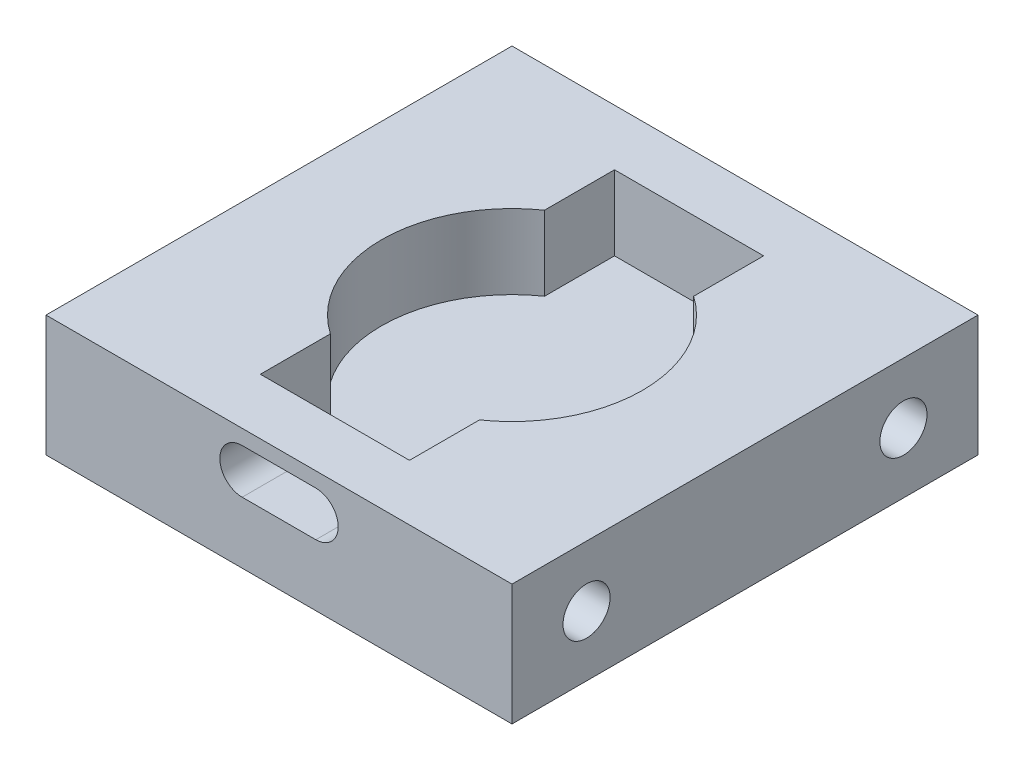
ISO-10303-21;
HEADER;
FILE_DESCRIPTION(('STEP AP214'),'2;1');
FILE_NAME('part.step','',(''),(''),'','','');
FILE_SCHEMA(('AUTOMOTIVE_DESIGN { 1 0 10303 214 1 1 1 1 }'));
ENDSEC;
DATA;
#1=APPLICATION_CONTEXT('core data for automotive mechanical design processes');
#2=APPLICATION_PROTOCOL_DEFINITION('international standard','automotive_design',2000,#1);
#3=PRODUCT_CONTEXT('',#1,'mechanical');
#4=PRODUCT('Part','Part','',(#3));
#5=PRODUCT_RELATED_PRODUCT_CATEGORY('part','',(#4));
#6=PRODUCT_DEFINITION_FORMATION('','',#4);
#7=PRODUCT_DEFINITION_CONTEXT('part definition',#1,'design');
#8=PRODUCT_DEFINITION('design','',#6,#7);
#9=PRODUCT_DEFINITION_SHAPE('','',#8);
#10=(LENGTH_UNIT() NAMED_UNIT(*) SI_UNIT(.MILLI.,.METRE.));
#11=(NAMED_UNIT(*) PLANE_ANGLE_UNIT() SI_UNIT($,.RADIAN.));
#12=(NAMED_UNIT(*) SI_UNIT($,.STERADIAN.) SOLID_ANGLE_UNIT());
#13=UNCERTAINTY_MEASURE_WITH_UNIT(LENGTH_MEASURE(1.E-05),#10,'distance_accuracy_value','');
#14=(GEOMETRIC_REPRESENTATION_CONTEXT(3) GLOBAL_UNCERTAINTY_ASSIGNED_CONTEXT((#13)) GLOBAL_UNIT_ASSIGNED_CONTEXT((#10,
#11,#12)) REPRESENTATION_CONTEXT('',''));
#15=CARTESIAN_POINT('',(0.,0.,0.));
#16=DIRECTION('',(0.,0.,1.));
#17=DIRECTION('',(1.,0.,0.));
#18=AXIS2_PLACEMENT_3D('',#15,#16,#17);
#19=CARTESIAN_POINT('',(-25.,13.,0.));
#20=DIRECTION('',(-1.,0.,0.));
#21=DIRECTION('',(0.,0.,1.));
#22=AXIS2_PLACEMENT_3D('',#19,#20,#21);
#23=PLANE('',#22);
#24=DIRECTION('',(0.,0.,-1.));
#25=VECTOR('',#24,1.);
#26=CARTESIAN_POINT('',(-25.,0.,0.));
#27=LINE('',#26,#25);
#28=CARTESIAN_POINT('',(-25.,0.,25.));
#29=VERTEX_POINT('',#28);
#30=CARTESIAN_POINT('',(-25.,0.,-25.));
#31=VERTEX_POINT('',#30);
#32=EDGE_CURVE('E293',#29,#31,#27,.T.);
#33=ORIENTED_EDGE('',*,*,#32,.F.);
#34=DIRECTION('',(0.,-1.,0.));
#35=VECTOR('',#34,1.);
#36=CARTESIAN_POINT('',(-25.,13.,25.));
#37=LINE('',#36,#35);
#38=CARTESIAN_POINT('',(-25.,13.,25.));
#39=VERTEX_POINT('',#38);
#40=EDGE_CURVE('E341',#39,#29,#37,.T.);
#41=ORIENTED_EDGE('',*,*,#40,.F.);
#42=DIRECTION('',(0.,0.,-1.));
#43=VECTOR('',#42,1.);
#44=CARTESIAN_POINT('',(-25.,13.,0.));
#45=LINE('',#44,#43);
#46=CARTESIAN_POINT('',(-25.,13.,-25.));
#47=VERTEX_POINT('',#46);
#48=EDGE_CURVE('E311',#39,#47,#45,.T.);
#49=ORIENTED_EDGE('',*,*,#48,.T.);
#50=DIRECTION('',(0.,-1.,0.));
#51=VECTOR('',#50,1.);
#52=CARTESIAN_POINT('',(-25.,13.,-25.));
#53=LINE('',#52,#51);
#54=EDGE_CURVE('E333',#47,#31,#53,.T.);
#55=ORIENTED_EDGE('',*,*,#54,.T.);
#56=EDGE_LOOP('',(#33,#41,#49,#55));
#57=FACE_BOUND('',#56,.T.);
#58=ADVANCED_FACE('F109',(#57),#23,.T.);
#59=CARTESIAN_POINT('',(0.,13.,25.));
#60=DIRECTION('',(0.,0.,1.));
#61=DIRECTION('',(1.,0.,0.));
#62=AXIS2_PLACEMENT_3D('',#59,#60,#61);
#63=PLANE('',#62);
#64=DIRECTION('',(1.,0.,0.));
#65=VECTOR('',#64,1.);
#66=CARTESIAN_POINT('',(-3.9497,6.59970000000003,25.));
#67=LINE('',#66,#65);
#68=CARTESIAN_POINT('',(-3.9497,6.59970000000001,25.));
#69=VERTEX_POINT('',#68);
#70=CARTESIAN_POINT('',(3.9497,6.59970000000003,25.));
#71=VERTEX_POINT('',#70);
#72=EDGE_CURVE('E253',#69,#71,#67,.T.);
#73=ORIENTED_EDGE('',*,*,#72,.F.);
#74=CARTESIAN_POINT('',(-3.9497,9.,25.));
#75=DIRECTION('',(0.,0.,1.));
#76=DIRECTION('',(1.,0.,0.));
#77=AXIS2_PLACEMENT_3D('',#74,#75,#76);
#78=CIRCLE('',#77,2.40029999999999);
#79=CARTESIAN_POINT('',(-3.9497,11.4003,25.));
#80=VERTEX_POINT('',#79);
#81=EDGE_CURVE('E252',#80,#69,#78,.T.);
#82=ORIENTED_EDGE('',*,*,#81,.F.);
#83=DIRECTION('',(1.,0.,0.));
#84=VECTOR('',#83,1.);
#85=CARTESIAN_POINT('',(-3.9497,11.4003,25.));
#86=LINE('',#85,#84);
#87=CARTESIAN_POINT('',(3.9497,11.4003,25.));
#88=VERTEX_POINT('',#87);
#89=EDGE_CURVE('E236',#80,#88,#86,.T.);
#90=ORIENTED_EDGE('',*,*,#89,.T.);
#91=CARTESIAN_POINT('',(3.9497,9.,25.));
#92=DIRECTION('',(0.,0.,1.));
#93=DIRECTION('',(1.,0.,0.));
#94=AXIS2_PLACEMENT_3D('',#91,#92,#93);
#95=CIRCLE('',#94,2.40029999999999);
#96=EDGE_CURVE('E241',#71,#88,#95,.T.);
#97=ORIENTED_EDGE('',*,*,#96,.F.);
#98=EDGE_LOOP('',(#73,#82,#90,#97));
#99=FACE_BOUND('',#98,.T.);
#100=DIRECTION('',(-1.,0.,0.));
#101=VECTOR('',#100,1.);
#102=CARTESIAN_POINT('',(0.,0.,25.));
#103=LINE('',#102,#101);
#104=CARTESIAN_POINT('',(25.,0.,25.));
#105=VERTEX_POINT('',#104);
#106=EDGE_CURVE('E325',#105,#29,#103,.T.);
#107=ORIENTED_EDGE('',*,*,#106,.F.);
#108=DIRECTION('',(0.,-1.,0.));
#109=VECTOR('',#108,1.);
#110=CARTESIAN_POINT('',(25.,13.,25.));
#111=LINE('',#110,#109);
#112=CARTESIAN_POINT('',(25.,13.,25.));
#113=VERTEX_POINT('',#112);
#114=EDGE_CURVE('E339',#113,#105,#111,.T.);
#115=ORIENTED_EDGE('',*,*,#114,.F.);
#116=DIRECTION('',(-1.,0.,0.));
#117=VECTOR('',#116,1.);
#118=CARTESIAN_POINT('',(0.,13.,25.));
#119=LINE('',#118,#117);
#120=EDGE_CURVE('E314',#113,#39,#119,.T.);
#121=ORIENTED_EDGE('',*,*,#120,.T.);
#122=ORIENTED_EDGE('',*,*,#40,.T.);
#123=EDGE_LOOP('',(#107,#115,#121,#122));
#124=FACE_BOUND('',#123,.T.);
#125=ADVANCED_FACE('F250',(#99,#124),#63,.T.);
#126=CARTESIAN_POINT('',(25.,13.,0.));
#127=DIRECTION('',(-1.,0.,0.));
#128=DIRECTION('',(0.,0.,1.));
#129=AXIS2_PLACEMENT_3D('',#126,#127,#128);
#130=PLANE('',#129);
#131=CARTESIAN_POINT('',(25.,6.5,17.));
#132=DIRECTION('',(1.,0.,0.));
#133=DIRECTION('',(0.,0.,-1.));
#134=AXIS2_PLACEMENT_3D('',#131,#132,#133);
#135=CIRCLE('',#134,2.52729999999999);
#136=CARTESIAN_POINT('',(25.,6.5,14.4727));
#137=VERTEX_POINT('',#136);
#138=EDGE_CURVE('E261',#137,#137,#135,.T.);
#139=ORIENTED_EDGE('',*,*,#138,.F.);
#140=EDGE_LOOP('',(#139));
#141=FACE_BOUND('',#140,.T.);
#142=CARTESIAN_POINT('',(25.,6.5,-17.));
#143=DIRECTION('',(1.,0.,0.));
#144=DIRECTION('',(0.,0.,-1.));
#145=AXIS2_PLACEMENT_3D('',#142,#143,#144);
#146=CIRCLE('',#145,2.52729999999999);
#147=CARTESIAN_POINT('',(25.,6.5,-19.5273));
#148=VERTEX_POINT('',#147);
#149=EDGE_CURVE('E266',#148,#148,#146,.T.);
#150=ORIENTED_EDGE('',*,*,#149,.F.);
#151=EDGE_LOOP('',(#150));
#152=FACE_BOUND('',#151,.T.);
#153=DIRECTION('',(0.,0.,-1.));
#154=VECTOR('',#153,1.);
#155=CARTESIAN_POINT('',(25.,0.,0.));
#156=LINE('',#155,#154);
#157=CARTESIAN_POINT('',(25.,0.,-25.));
#158=VERTEX_POINT('',#157);
#159=EDGE_CURVE('E328',#105,#158,#156,.T.);
#160=ORIENTED_EDGE('',*,*,#159,.T.);
#161=DIRECTION('',(0.,-1.,0.));
#162=VECTOR('',#161,1.);
#163=CARTESIAN_POINT('',(25.,13.,-25.));
#164=LINE('',#163,#162);
#165=CARTESIAN_POINT('',(25.,13.,-25.));
#166=VERTEX_POINT('',#165);
#167=EDGE_CURVE('E335',#166,#158,#164,.T.);
#168=ORIENTED_EDGE('',*,*,#167,.F.);
#169=DIRECTION('',(0.,0.,-1.));
#170=VECTOR('',#169,1.);
#171=CARTESIAN_POINT('',(25.,13.,0.));
#172=LINE('',#171,#170);
#173=EDGE_CURVE('E317',#113,#166,#172,.T.);
#174=ORIENTED_EDGE('',*,*,#173,.F.);
#175=ORIENTED_EDGE('',*,*,#114,.T.);
#176=EDGE_LOOP('',(#160,#168,#174,#175));
#177=FACE_BOUND('',#176,.T.);
#178=ADVANCED_FACE('F399',(#141,#152,#177),#130,.F.);
#179=CARTESIAN_POINT('',(0.,13.,0.));
#180=DIRECTION('',(0.,-1.,0.));
#181=DIRECTION('',(0.,0.,-1.));
#182=AXIS2_PLACEMENT_3D('',#179,#180,#181);
#183=CYLINDRICAL_SURFACE('',#182,14.);
#184=CARTESIAN_POINT('',(0.,5.,0.));
#185=DIRECTION('',(0.,1.,0.));
#186=DIRECTION('',(0.,0.,1.));
#187=AXIS2_PLACEMENT_3D('',#184,#185,#186);
#188=CIRCLE('',#187,14.);
#189=CARTESIAN_POINT('',(8.00000000000001,5.,11.4891252930761));
#190=VERTEX_POINT('',#189);
#191=CARTESIAN_POINT('',(8.00000000000001,5.,-11.4891252930761));
#192=VERTEX_POINT('',#191);
#193=EDGE_CURVE('E275',#190,#192,#188,.T.);
#194=ORIENTED_EDGE('',*,*,#193,.F.);
#195=DIRECTION('',(0.,-1.,0.));
#196=VECTOR('',#195,1.);
#197=CARTESIAN_POINT('',(8.00000000000001,13.,11.4891252930761));
#198=LINE('',#197,#196);
#199=CARTESIAN_POINT('',(8.00000000000001,13.,11.4891252930761));
#200=VERTEX_POINT('',#199);
#201=EDGE_CURVE('E336',#200,#190,#198,.T.);
#202=ORIENTED_EDGE('',*,*,#201,.F.);
#203=CARTESIAN_POINT('',(0.,13.,0.));
#204=DIRECTION('',(0.,1.,0.));
#205=DIRECTION('',(0.,0.,1.));
#206=AXIS2_PLACEMENT_3D('',#203,#204,#205);
#207=CIRCLE('',#206,14.);
#208=CARTESIAN_POINT('',(8.00000000000001,13.,-11.4891252930761));
#209=VERTEX_POINT('',#208);
#210=EDGE_CURVE('E294',#200,#209,#207,.T.);
#211=ORIENTED_EDGE('',*,*,#210,.T.);
#212=DIRECTION('',(0.,-1.,0.));
#213=VECTOR('',#212,1.);
#214=CARTESIAN_POINT('',(8.00000000000001,13.,-11.4891252930761));
#215=LINE('',#214,#213);
#216=EDGE_CURVE('E322',#209,#192,#215,.T.);
#217=ORIENTED_EDGE('',*,*,#216,.T.);
#218=EDGE_LOOP('',(#194,#202,#211,#217));
#219=FACE_BOUND('',#218,.T.);
#220=ADVANCED_FACE('F421',(#219),#183,.F.);
#221=CARTESIAN_POINT('',(8.00000000000001,13.,0.));
#222=DIRECTION('',(1.,0.,0.));
#223=DIRECTION('',(0.,0.,-1.));
#224=AXIS2_PLACEMENT_3D('',#221,#222,#223);
#225=PLANE('',#224);
#226=DIRECTION('',(0.,0.,1.));
#227=VECTOR('',#226,1.);
#228=CARTESIAN_POINT('',(8.00000000000001,5.,0.));
#229=LINE('',#228,#227);
#230=CARTESIAN_POINT('',(8.,5.,14.9659780507576));
#231=VERTEX_POINT('',#230);
#232=EDGE_CURVE('E272',#190,#231,#229,.T.);
#233=ORIENTED_EDGE('',*,*,#232,.T.);
#234=CARTESIAN_POINT('',(8.,6.5,17.));
#235=DIRECTION('',(1.,0.,0.));
#236=DIRECTION('',(0.,0.,-1.));
#237=AXIS2_PLACEMENT_3D('',#234,#235,#236);
#238=CIRCLE('',#237,2.52729999999999);
#239=CARTESIAN_POINT('',(8.,8.0450712896174,19.));
#240=VERTEX_POINT('',#239);
#241=EDGE_CURVE('E370',#231,#240,#238,.T.);
#242=ORIENTED_EDGE('',*,*,#241,.T.);
#243=DIRECTION('',(0.,-1.,0.));
#244=VECTOR('',#243,1.);
#245=CARTESIAN_POINT('',(8.00000000000001,13.,19.));
#246=LINE('',#245,#244);
#247=CARTESIAN_POINT('',(8.00000000000001,13.,19.));
#248=VERTEX_POINT('',#247);
#249=EDGE_CURVE('E363',#248,#240,#246,.T.);
#250=ORIENTED_EDGE('',*,*,#249,.F.);
#251=DIRECTION('',(0.,0.,1.));
#252=VECTOR('',#251,1.);
#253=CARTESIAN_POINT('',(8.00000000000001,13.,0.));
#254=LINE('',#253,#252);
#255=EDGE_CURVE('E297',#200,#248,#254,.T.);
#256=ORIENTED_EDGE('',*,*,#255,.F.);
#257=ORIENTED_EDGE('',*,*,#201,.T.);
#258=EDGE_LOOP('',(#233,#242,#250,#256,#257));
#259=FACE_BOUND('',#258,.T.);
#260=ADVANCED_FACE('F410',(#259),#225,.F.);
#261=CARTESIAN_POINT('',(0.,13.,19.));
#262=DIRECTION('',(0.,0.,1.));
#263=DIRECTION('',(1.,0.,0.));
#264=AXIS2_PLACEMENT_3D('',#261,#262,#263);
#265=PLANE('',#264);
#266=CARTESIAN_POINT('',(3.9497,9.,19.));
#267=DIRECTION('',(0.,0.,1.));
#268=DIRECTION('',(1.,0.,0.));
#269=AXIS2_PLACEMENT_3D('',#266,#267,#268);
#270=CIRCLE('',#269,2.40029999999999);
#271=CARTESIAN_POINT('',(3.9497,6.59970000000001,19.));
#272=VERTEX_POINT('',#271);
#273=CARTESIAN_POINT('',(3.9497,11.4003,19.));
#274=VERTEX_POINT('',#273);
#275=EDGE_CURVE('E117',#272,#274,#270,.T.);
#276=ORIENTED_EDGE('',*,*,#275,.T.);
#277=DIRECTION('',(-1.,0.,0.));
#278=VECTOR('',#277,1.);
#279=CARTESIAN_POINT('',(0.,11.4003,19.));
#280=LINE('',#279,#278);
#281=CARTESIAN_POINT('',(-3.9497,11.4003,19.));
#282=VERTEX_POINT('',#281);
#283=EDGE_CURVE('E13',#274,#282,#280,.T.);
#284=ORIENTED_EDGE('',*,*,#283,.T.);
#285=CARTESIAN_POINT('',(-3.9497,9.,19.));
#286=DIRECTION('',(0.,0.,1.));
#287=DIRECTION('',(1.,0.,0.));
#288=AXIS2_PLACEMENT_3D('',#285,#286,#287);
#289=CIRCLE('',#288,2.40029999999999);
#290=CARTESIAN_POINT('',(-3.9497,6.59970000000001,19.));
#291=VERTEX_POINT('',#290);
#292=EDGE_CURVE('E376',#282,#291,#289,.T.);
#293=ORIENTED_EDGE('',*,*,#292,.T.);
#294=DIRECTION('',(1.,0.,0.));
#295=VECTOR('',#294,1.);
#296=CARTESIAN_POINT('',(0.,6.59970000000001,19.));
#297=LINE('',#296,#295);
#298=EDGE_CURVE('E373',#291,#272,#297,.T.);
#299=ORIENTED_EDGE('',*,*,#298,.T.);
#300=EDGE_LOOP('',(#276,#284,#293,#299));
#301=FACE_BOUND('',#300,.T.);
#302=ORIENTED_EDGE('',*,*,#249,.T.);
#303=CARTESIAN_POINT('',(8.00000000000001,5.,19.));
#304=VERTEX_POINT('',#303);
#305=EDGE_CURVE('E362',#240,#304,#246,.T.);
#306=ORIENTED_EDGE('',*,*,#305,.T.);
#307=DIRECTION('',(-1.,0.,0.));
#308=VECTOR('',#307,1.);
#309=CARTESIAN_POINT('',(0.,5.,19.));
#310=LINE('',#309,#308);
#311=CARTESIAN_POINT('',(-7.99999999999999,5.,19.));
#312=VERTEX_POINT('',#311);
#313=EDGE_CURVE('E290',#304,#312,#310,.T.);
#314=ORIENTED_EDGE('',*,*,#313,.T.);
#315=DIRECTION('',(0.,-1.,0.));
#316=VECTOR('',#315,1.);
#317=CARTESIAN_POINT('',(-7.99999999999999,13.,19.));
#318=LINE('',#317,#316);
#319=CARTESIAN_POINT('',(-7.99999999999999,13.,19.));
#320=VERTEX_POINT('',#319);
#321=EDGE_CURVE('E359',#320,#312,#318,.T.);
#322=ORIENTED_EDGE('',*,*,#321,.F.);
#323=DIRECTION('',(-1.,0.,0.));
#324=VECTOR('',#323,1.);
#325=CARTESIAN_POINT('',(0.,13.,19.));
#326=LINE('',#325,#324);
#327=EDGE_CURVE('E301',#248,#320,#326,.T.);
#328=ORIENTED_EDGE('',*,*,#327,.F.);
#329=EDGE_LOOP('',(#302,#306,#314,#322,#328));
#330=FACE_BOUND('',#329,.T.);
#331=ADVANCED_FACE('F111',(#301,#330),#265,.F.);
#332=CARTESIAN_POINT('',(-8.,13.,0.));
#333=DIRECTION('',(1.,0.,0.));
#334=DIRECTION('',(0.,0.,-1.));
#335=AXIS2_PLACEMENT_3D('',#332,#333,#334);
#336=PLANE('',#335);
#337=DIRECTION('',(0.,0.,1.));
#338=VECTOR('',#337,1.);
#339=CARTESIAN_POINT('',(-8.,5.,0.));
#340=LINE('',#339,#338);
#341=CARTESIAN_POINT('',(-7.99999999999999,5.,11.4891252930761));
#342=VERTEX_POINT('',#341);
#343=EDGE_CURVE('E288',#342,#312,#340,.T.);
#344=ORIENTED_EDGE('',*,*,#343,.F.);
#345=DIRECTION('',(0.,-1.,0.));
#346=VECTOR('',#345,1.);
#347=CARTESIAN_POINT('',(-7.99999999999999,13.,11.4891252930761));
#348=LINE('',#347,#346);
#349=CARTESIAN_POINT('',(-7.99999999999999,13.,11.4891252930761));
#350=VERTEX_POINT('',#349);
#351=EDGE_CURVE('E356',#350,#342,#348,.T.);
#352=ORIENTED_EDGE('',*,*,#351,.F.);
#353=DIRECTION('',(0.,0.,1.));
#354=VECTOR('',#353,1.);
#355=CARTESIAN_POINT('',(-8.,13.,0.));
#356=LINE('',#355,#354);
#357=EDGE_CURVE('E304',#350,#320,#356,.T.);
#358=ORIENTED_EDGE('',*,*,#357,.T.);
#359=ORIENTED_EDGE('',*,*,#321,.T.);
#360=EDGE_LOOP('',(#344,#352,#358,#359));
#361=FACE_BOUND('',#360,.T.);
#362=ADVANCED_FACE('F418',(#361),#336,.T.);
#363=CARTESIAN_POINT('',(0.,5.,0.));
#364=DIRECTION('',(0.,1.,0.));
#365=DIRECTION('',(0.,0.,1.));
#366=AXIS2_PLACEMENT_3D('',#363,#364,#365);
#367=CIRCLE('',#366,14.);
#368=CARTESIAN_POINT('',(-8.,5.,-11.4891252930761));
#369=VERTEX_POINT('',#368);
#370=EDGE_CURVE('E286',#369,#342,#367,.T.);
#371=ORIENTED_EDGE('',*,*,#370,.F.);
#372=DIRECTION('',(0.,-1.,0.));
#373=VECTOR('',#372,1.);
#374=CARTESIAN_POINT('',(-8.,13.,-11.4891252930761));
#375=LINE('',#374,#373);
#376=CARTESIAN_POINT('',(-8.,13.,-11.4891252930761));
#377=VERTEX_POINT('',#376);
#378=EDGE_CURVE('E353',#377,#369,#375,.T.);
#379=ORIENTED_EDGE('',*,*,#378,.F.);
#380=EDGE_CURVE('E299',#377,#350,#207,.T.);
#381=ORIENTED_EDGE('',*,*,#380,.T.);
#382=ORIENTED_EDGE('',*,*,#351,.T.);
#383=EDGE_LOOP('',(#371,#379,#381,#382));
#384=FACE_BOUND('',#383,.T.);
#385=ADVANCED_FACE('F416',(#384),#183,.F.);
#386=DIRECTION('',(0.,0.,1.));
#387=VECTOR('',#386,1.);
#388=CARTESIAN_POINT('',(-8.,5.,0.));
#389=LINE('',#388,#387);
#390=CARTESIAN_POINT('',(-8.,5.,-19.));
#391=VERTEX_POINT('',#390);
#392=EDGE_CURVE('E284',#391,#369,#389,.T.);
#393=ORIENTED_EDGE('',*,*,#392,.F.);
#394=DIRECTION('',(0.,-1.,0.));
#395=VECTOR('',#394,1.);
#396=CARTESIAN_POINT('',(-8.,13.,-19.));
#397=LINE('',#396,#395);
#398=CARTESIAN_POINT('',(-8.,13.,-19.));
#399=VERTEX_POINT('',#398);
#400=EDGE_CURVE('E350',#399,#391,#397,.T.);
#401=ORIENTED_EDGE('',*,*,#400,.F.);
#402=EDGE_CURVE('E307',#399,#377,#356,.T.);
#403=ORIENTED_EDGE('',*,*,#402,.T.);
#404=ORIENTED_EDGE('',*,*,#378,.T.);
#405=EDGE_LOOP('',(#393,#401,#403,#404));
#406=FACE_BOUND('',#405,.T.);
#407=ADVANCED_FACE('F413',(#406),#336,.T.);
#408=CARTESIAN_POINT('',(0.,13.,-19.));
#409=DIRECTION('',(0.,0.,1.));
#410=DIRECTION('',(1.,0.,0.));
#411=AXIS2_PLACEMENT_3D('',#408,#409,#410);
#412=PLANE('',#411);
#413=DIRECTION('',(-1.,0.,0.));
#414=VECTOR('',#413,1.);
#415=CARTESIAN_POINT('',(0.,5.,-19.));
#416=LINE('',#415,#414);
#417=CARTESIAN_POINT('',(8.00000000000001,5.,-19.));
#418=VERTEX_POINT('',#417);
#419=EDGE_CURVE('E282',#418,#391,#416,.T.);
#420=ORIENTED_EDGE('',*,*,#419,.F.);
#421=DIRECTION('',(0.,-1.,0.));
#422=VECTOR('',#421,1.);
#423=CARTESIAN_POINT('',(8.00000000000001,13.,-19.));
#424=LINE('',#423,#422);
#425=CARTESIAN_POINT('',(8.,8.04507128961741,-19.));
#426=VERTEX_POINT('',#425);
#427=EDGE_CURVE('E346',#426,#418,#424,.T.);
#428=ORIENTED_EDGE('',*,*,#427,.F.);
#429=CARTESIAN_POINT('',(8.00000000000001,13.,-19.));
#430=VERTEX_POINT('',#429);
#431=EDGE_CURVE('E347',#430,#426,#424,.T.);
#432=ORIENTED_EDGE('',*,*,#431,.F.);
#433=DIRECTION('',(-1.,0.,0.));
#434=VECTOR('',#433,1.);
#435=CARTESIAN_POINT('',(0.,13.,-19.));
#436=LINE('',#435,#434);
#437=EDGE_CURVE('E308',#430,#399,#436,.T.);
#438=ORIENTED_EDGE('',*,*,#437,.T.);
#439=ORIENTED_EDGE('',*,*,#400,.T.);
#440=EDGE_LOOP('',(#420,#428,#432,#438,#439));
#441=FACE_BOUND('',#440,.T.);
#442=ADVANCED_FACE('F408',(#441),#412,.T.);
#443=ORIENTED_EDGE('',*,*,#431,.T.);
#444=CARTESIAN_POINT('',(8.,6.5,-17.));
#445=DIRECTION('',(1.,0.,0.));
#446=DIRECTION('',(0.,0.,-1.));
#447=AXIS2_PLACEMENT_3D('',#444,#445,#446);
#448=CIRCLE('',#447,2.52729999999999);
#449=CARTESIAN_POINT('',(8.,5.,-14.9659780507576));
#450=VERTEX_POINT('',#449);
#451=EDGE_CURVE('E343',#426,#450,#448,.T.);
#452=ORIENTED_EDGE('',*,*,#451,.T.);
#453=DIRECTION('',(0.,0.,1.));
#454=VECTOR('',#453,1.);
#455=CARTESIAN_POINT('',(8.00000000000001,5.,0.));
#456=LINE('',#455,#454);
#457=EDGE_CURVE('E278',#450,#192,#456,.T.);
#458=ORIENTED_EDGE('',*,*,#457,.T.);
#459=ORIENTED_EDGE('',*,*,#216,.F.);
#460=EDGE_CURVE('E302',#430,#209,#254,.T.);
#461=ORIENTED_EDGE('',*,*,#460,.F.);
#462=EDGE_LOOP('',(#443,#452,#458,#459,#461));
#463=FACE_BOUND('',#462,.T.);
#464=ADVANCED_FACE('F404',(#463),#225,.F.);
#465=CARTESIAN_POINT('',(0.,13.,-25.));
#466=DIRECTION('',(0.,0.,1.));
#467=DIRECTION('',(1.,0.,0.));
#468=AXIS2_PLACEMENT_3D('',#465,#466,#467);
#469=PLANE('',#468);
#470=DIRECTION('',(-1.,0.,0.));
#471=VECTOR('',#470,1.);
#472=CARTESIAN_POINT('',(0.,0.,-25.));
#473=LINE('',#472,#471);
#474=EDGE_CURVE('E298',#158,#31,#473,.T.);
#475=ORIENTED_EDGE('',*,*,#474,.T.);
#476=ORIENTED_EDGE('',*,*,#54,.F.);
#477=DIRECTION('',(-1.,0.,0.));
#478=VECTOR('',#477,1.);
#479=CARTESIAN_POINT('',(0.,13.,-25.));
#480=LINE('',#479,#478);
#481=EDGE_CURVE('E320',#166,#47,#480,.T.);
#482=ORIENTED_EDGE('',*,*,#481,.F.);
#483=ORIENTED_EDGE('',*,*,#167,.T.);
#484=EDGE_LOOP('',(#475,#476,#482,#483));
#485=FACE_BOUND('',#484,.T.);
#486=ADVANCED_FACE('F407',(#485),#469,.F.);
#487=CARTESIAN_POINT('',(0.,13.,0.));
#488=DIRECTION('',(0.,1.,0.));
#489=DIRECTION('',(0.,0.,1.));
#490=AXIS2_PLACEMENT_3D('',#487,#488,#489);
#491=PLANE('',#490);
#492=ORIENTED_EDGE('',*,*,#210,.F.);
#493=ORIENTED_EDGE('',*,*,#255,.T.);
#494=ORIENTED_EDGE('',*,*,#327,.T.);
#495=ORIENTED_EDGE('',*,*,#357,.F.);
#496=ORIENTED_EDGE('',*,*,#380,.F.);
#497=ORIENTED_EDGE('',*,*,#402,.F.);
#498=ORIENTED_EDGE('',*,*,#437,.F.);
#499=ORIENTED_EDGE('',*,*,#460,.T.);
#500=EDGE_LOOP('',(#492,#493,#494,#495,#496,#497,#498,#499));
#501=FACE_BOUND('',#500,.T.);
#502=ORIENTED_EDGE('',*,*,#48,.F.);
#503=ORIENTED_EDGE('',*,*,#120,.F.);
#504=ORIENTED_EDGE('',*,*,#173,.T.);
#505=ORIENTED_EDGE('',*,*,#481,.T.);
#506=EDGE_LOOP('',(#502,#503,#504,#505));
#507=FACE_BOUND('',#506,.T.);
#508=ADVANCED_FACE('F446',(#501,#507),#491,.T.);
#509=CARTESIAN_POINT('',(0.,0.,0.));
#510=DIRECTION('',(0.,1.,0.));
#511=DIRECTION('',(0.,0.,1.));
#512=AXIS2_PLACEMENT_3D('',#509,#510,#511);
#513=PLANE('',#512);
#514=ORIENTED_EDGE('',*,*,#32,.T.);
#515=ORIENTED_EDGE('',*,*,#474,.F.);
#516=ORIENTED_EDGE('',*,*,#159,.F.);
#517=ORIENTED_EDGE('',*,*,#106,.T.);
#518=EDGE_LOOP('',(#514,#515,#516,#517));
#519=FACE_BOUND('',#518,.T.);
#520=ADVANCED_FACE('F484',(#519),#513,.F.);
#521=CARTESIAN_POINT('',(0.,5.,0.));
#522=DIRECTION('',(0.,1.,0.));
#523=DIRECTION('',(0.,0.,1.));
#524=AXIS2_PLACEMENT_3D('',#521,#522,#523);
#525=PLANE('',#524);
#526=ORIENTED_EDGE('',*,*,#232,.F.);
#527=ORIENTED_EDGE('',*,*,#193,.T.);
#528=ORIENTED_EDGE('',*,*,#457,.F.);
#529=EDGE_CURVE('E279',#418,#450,#456,.T.);
#530=ORIENTED_EDGE('',*,*,#529,.F.);
#531=ORIENTED_EDGE('',*,*,#419,.T.);
#532=ORIENTED_EDGE('',*,*,#392,.T.);
#533=ORIENTED_EDGE('',*,*,#370,.T.);
#534=ORIENTED_EDGE('',*,*,#343,.T.);
#535=ORIENTED_EDGE('',*,*,#313,.F.);
#536=EDGE_CURVE('E271',#231,#304,#229,.T.);
#537=ORIENTED_EDGE('',*,*,#536,.F.);
#538=EDGE_LOOP('',(#526,#527,#528,#530,#531,#532,#533,#534,#535,#537));
#539=FACE_BOUND('',#538,.T.);
#540=ADVANCED_FACE('F452',(#539),#525,.T.);
#541=CARTESIAN_POINT('',(8.00000000000001,13.,0.));
#542=DIRECTION('',(1.,0.,0.));
#543=DIRECTION('',(0.,0.,-1.));
#544=AXIS2_PLACEMENT_3D('',#541,#542,#543);
#545=PLANE('',#544);
#546=ORIENTED_EDGE('',*,*,#427,.T.);
#547=ORIENTED_EDGE('',*,*,#529,.T.);
#548=CARTESIAN_POINT('',(8.,6.5,-17.));
#549=DIRECTION('',(1.,0.,0.));
#550=DIRECTION('',(0.,0.,-1.));
#551=AXIS2_PLACEMENT_3D('',#548,#549,#550);
#552=CIRCLE('',#551,2.52729999999999);
#553=EDGE_CURVE('E269',#426,#450,#552,.F.);
#554=ORIENTED_EDGE('',*,*,#553,.F.);
#555=EDGE_LOOP('',(#546,#547,#554));
#556=FACE_BOUND('',#555,.T.);
#557=ADVANCED_FACE('F500',(#556),#545,.T.);
#558=CARTESIAN_POINT('',(25.,6.5,-17.));
#559=DIRECTION('',(1.,0.,0.));
#560=DIRECTION('',(0.,0.,-1.));
#561=AXIS2_PLACEMENT_3D('',#558,#559,#560);
#562=CYLINDRICAL_SURFACE('',#561,2.52729999999999);
#563=ORIENTED_EDGE('',*,*,#553,.T.);
#564=ORIENTED_EDGE('',*,*,#451,.F.);
#565=EDGE_LOOP('',(#563,#564));
#566=FACE_BOUND('',#565,.T.);
#567=ORIENTED_EDGE('',*,*,#149,.T.);
#568=EDGE_LOOP('',(#567));
#569=FACE_BOUND('',#568,.T.);
#570=ADVANCED_FACE('F501',(#566,#569),#562,.F.);
#571=CARTESIAN_POINT('',(8.00000000000001,13.,0.));
#572=DIRECTION('',(1.,0.,0.));
#573=DIRECTION('',(0.,0.,-1.));
#574=AXIS2_PLACEMENT_3D('',#571,#572,#573);
#575=PLANE('',#574);
#576=ORIENTED_EDGE('',*,*,#536,.T.);
#577=ORIENTED_EDGE('',*,*,#305,.F.);
#578=CARTESIAN_POINT('',(8.,6.5,17.));
#579=DIRECTION('',(1.,0.,0.));
#580=DIRECTION('',(0.,0.,-1.));
#581=AXIS2_PLACEMENT_3D('',#578,#579,#580);
#582=CIRCLE('',#581,2.52729999999999);
#583=EDGE_CURVE('E264',#231,#240,#582,.F.);
#584=ORIENTED_EDGE('',*,*,#583,.F.);
#585=EDGE_LOOP('',(#576,#577,#584));
#586=FACE_BOUND('',#585,.T.);
#587=ADVANCED_FACE('F470',(#586),#575,.T.);
#588=CARTESIAN_POINT('',(25.,6.5,17.));
#589=DIRECTION('',(1.,0.,0.));
#590=DIRECTION('',(0.,0.,-1.));
#591=AXIS2_PLACEMENT_3D('',#588,#589,#590);
#592=CYLINDRICAL_SURFACE('',#591,2.52729999999999);
#593=ORIENTED_EDGE('',*,*,#583,.T.);
#594=ORIENTED_EDGE('',*,*,#241,.F.);
#595=EDGE_LOOP('',(#593,#594));
#596=FACE_BOUND('',#595,.T.);
#597=ORIENTED_EDGE('',*,*,#138,.T.);
#598=EDGE_LOOP('',(#597));
#599=FACE_BOUND('',#598,.T.);
#600=ADVANCED_FACE('F390',(#596,#599),#592,.F.);
#601=CARTESIAN_POINT('',(3.9497,9.,25.));
#602=DIRECTION('',(0.,0.,1.));
#603=DIRECTION('',(1.,0.,0.));
#604=AXIS2_PLACEMENT_3D('',#601,#602,#603);
#605=CYLINDRICAL_SURFACE('',#604,2.40029999999999);
#606=DIRECTION('',(0.,0.,1.));
#607=VECTOR('',#606,1.);
#608=CARTESIAN_POINT('',(3.9497,6.59970000000001,25.));
#609=LINE('',#608,#607);
#610=EDGE_CURVE('E240',#71,#272,#609,.F.);
#611=ORIENTED_EDGE('',*,*,#610,.F.);
#612=ORIENTED_EDGE('',*,*,#96,.T.);
#613=DIRECTION('',(0.,0.,1.));
#614=VECTOR('',#613,1.);
#615=CARTESIAN_POINT('',(3.9497,11.4003,25.));
#616=LINE('',#615,#614);
#617=EDGE_CURVE('E232',#274,#88,#616,.T.);
#618=ORIENTED_EDGE('',*,*,#617,.F.);
#619=ORIENTED_EDGE('',*,*,#275,.F.);
#620=EDGE_LOOP('',(#611,#612,#618,#619));
#621=FACE_BOUND('',#620,.T.);
#622=ADVANCED_FACE('F245',(#621),#605,.F.);
#623=CARTESIAN_POINT('',(-3.9497,9.,25.));
#624=DIRECTION('',(0.,0.,1.));
#625=DIRECTION('',(1.,0.,0.));
#626=AXIS2_PLACEMENT_3D('',#623,#624,#625);
#627=CYLINDRICAL_SURFACE('',#626,2.40029999999999);
#628=DIRECTION('',(0.,0.,1.));
#629=VECTOR('',#628,1.);
#630=CARTESIAN_POINT('',(-3.9497,11.4003,25.));
#631=LINE('',#630,#629);
#632=EDGE_CURVE('E124',#80,#282,#631,.F.);
#633=ORIENTED_EDGE('',*,*,#632,.F.);
#634=ORIENTED_EDGE('',*,*,#81,.T.);
#635=DIRECTION('',(0.,0.,1.));
#636=VECTOR('',#635,1.);
#637=CARTESIAN_POINT('',(-3.9497,6.59970000000001,25.));
#638=LINE('',#637,#636);
#639=EDGE_CURVE('E129',#291,#69,#638,.T.);
#640=ORIENTED_EDGE('',*,*,#639,.F.);
#641=ORIENTED_EDGE('',*,*,#292,.F.);
#642=EDGE_LOOP('',(#633,#634,#640,#641));
#643=FACE_BOUND('',#642,.T.);
#644=ADVANCED_FACE('F382',(#643),#627,.F.);
#645=CARTESIAN_POINT('',(-3.9497,11.4003,25.));
#646=DIRECTION('',(0.,1.,0.));
#647=DIRECTION('',(0.,0.,1.));
#648=AXIS2_PLACEMENT_3D('',#645,#646,#647);
#649=PLANE('',#648);
#650=ORIENTED_EDGE('',*,*,#617,.T.);
#651=ORIENTED_EDGE('',*,*,#89,.F.);
#652=ORIENTED_EDGE('',*,*,#632,.T.);
#653=ORIENTED_EDGE('',*,*,#283,.F.);
#654=EDGE_LOOP('',(#650,#651,#652,#653));
#655=FACE_BOUND('',#654,.T.);
#656=ADVANCED_FACE('F234',(#655),#649,.F.);
#657=CARTESIAN_POINT('',(-3.9497,6.59970000000001,25.));
#658=DIRECTION('',(0.,-1.,0.));
#659=DIRECTION('',(0.,0.,-1.));
#660=AXIS2_PLACEMENT_3D('',#657,#658,#659);
#661=PLANE('',#660);
#662=ORIENTED_EDGE('',*,*,#639,.T.);
#663=ORIENTED_EDGE('',*,*,#72,.T.);
#664=ORIENTED_EDGE('',*,*,#610,.T.);
#665=ORIENTED_EDGE('',*,*,#298,.F.);
#666=EDGE_LOOP('',(#662,#663,#664,#665));
#667=FACE_BOUND('',#666,.T.);
#668=ADVANCED_FACE('F381',(#667),#661,.F.);
#669=CLOSED_SHELL('',(#58,#125,#178,#220,#260,#331,#362,#385,#407,#442,#464,#486,#508,#520,#540,
#557,#570,#587,#600,#622,#644,#656,#668));
#670=MANIFOLD_SOLID_BREP('B2',#669);
#671=ADVANCED_BREP_SHAPE_REPRESENTATION('',(#18,#670),#14);
#672=SHAPE_DEFINITION_REPRESENTATION(#9,#671);
ENDSEC;
END-ISO-10303-21;
